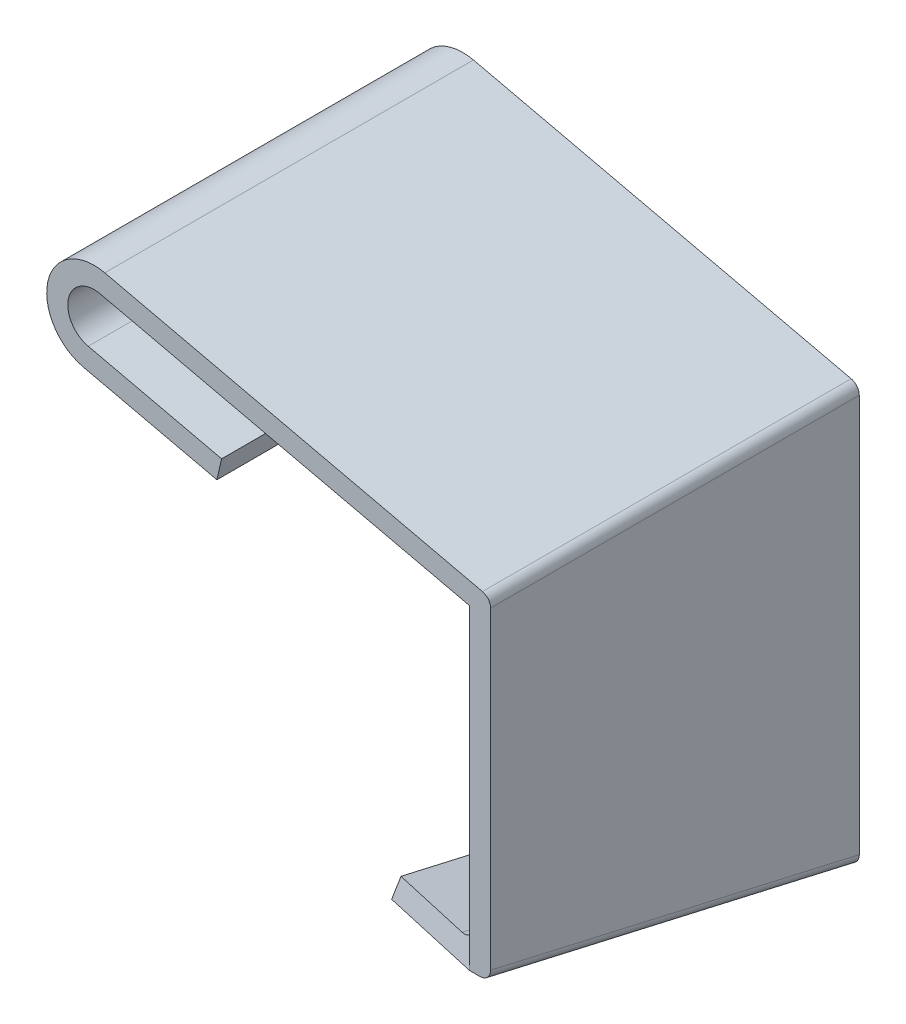
ISO-10303-21;
HEADER;
FILE_DESCRIPTION(('STEP AP214'),'2;1');
FILE_NAME('part.step','',(''),(''),'','','');
FILE_SCHEMA(('AUTOMOTIVE_DESIGN { 1 0 10303 214 1 1 1 1 }'));
ENDSEC;
DATA;
#1=APPLICATION_CONTEXT('core data for automotive mechanical design processes');
#2=APPLICATION_PROTOCOL_DEFINITION('international standard','automotive_design',2000,#1);
#3=PRODUCT_CONTEXT('',#1,'mechanical');
#4=PRODUCT('Part','Part','',(#3));
#5=PRODUCT_RELATED_PRODUCT_CATEGORY('part','',(#4));
#6=PRODUCT_DEFINITION_FORMATION('','',#4);
#7=PRODUCT_DEFINITION_CONTEXT('part definition',#1,'design');
#8=PRODUCT_DEFINITION('design','',#6,#7);
#9=PRODUCT_DEFINITION_SHAPE('','',#8);
#10=(LENGTH_UNIT() NAMED_UNIT(*) SI_UNIT(.MILLI.,.METRE.));
#11=(NAMED_UNIT(*) PLANE_ANGLE_UNIT() SI_UNIT($,.RADIAN.));
#12=(NAMED_UNIT(*) SI_UNIT($,.STERADIAN.) SOLID_ANGLE_UNIT());
#13=UNCERTAINTY_MEASURE_WITH_UNIT(LENGTH_MEASURE(1.E-05),#10,'distance_accuracy_value','');
#14=(GEOMETRIC_REPRESENTATION_CONTEXT(3) GLOBAL_UNCERTAINTY_ASSIGNED_CONTEXT((#13)) GLOBAL_UNIT_ASSIGNED_CONTEXT((#10,
#11,#12)) REPRESENTATION_CONTEXT('',''));
#15=CARTESIAN_POINT('',(0.,0.,0.));
#16=DIRECTION('',(0.,0.,1.));
#17=DIRECTION('',(1.,0.,0.));
#18=AXIS2_PLACEMENT_3D('',#15,#16,#17);
#19=CARTESIAN_POINT('',(-36.6519797126755,22.2084590531682,35.));
#20=DIRECTION('',(0.224951054343865,0.974370064785235,0.));
#21=DIRECTION('',(-0.974370064785235,0.224951054343865,0.));
#22=AXIS2_PLACEMENT_3D('',#19,#20,#21);
#23=PLANE('',#22);
#24=DIRECTION('',(0.974370064785235,-0.224951054343865,0.));
#25=VECTOR('',#24,1.);
#26=CARTESIAN_POINT('',(-36.6519797126755,22.2084590531682,0.));
#27=LINE('',#26,#25);
#28=CARTESIAN_POINT('',(-36.6519797126755,22.2084590531682,0.));
#29=VERTEX_POINT('',#28);
#30=CARTESIAN_POINT('',(-23.9851688704675,19.284095346698,0.));
#31=VERTEX_POINT('',#30);
#32=EDGE_CURVE('E226',#29,#31,#27,.T.);
#33=ORIENTED_EDGE('',*,*,#32,.T.);
#34=DIRECTION('',(0.,0.,-1.));
#35=VECTOR('',#34,1.);
#36=CARTESIAN_POINT('',(-23.9851688704675,19.284095346698,35.));
#37=LINE('',#36,#35);
#38=CARTESIAN_POINT('',(-23.9851688704675,19.284095346698,35.));
#39=VERTEX_POINT('',#38);
#40=EDGE_CURVE('E314',#39,#31,#37,.T.);
#41=ORIENTED_EDGE('',*,*,#40,.F.);
#42=DIRECTION('',(0.974370064785235,-0.224951054343865,0.));
#43=VECTOR('',#42,1.);
#44=CARTESIAN_POINT('',(-36.6519797126755,22.2084590531682,35.));
#45=LINE('',#44,#43);
#46=CARTESIAN_POINT('',(-36.6519797126755,22.2084590531682,35.));
#47=VERTEX_POINT('',#46);
#48=EDGE_CURVE('E227',#47,#39,#45,.T.);
#49=ORIENTED_EDGE('',*,*,#48,.F.);
#50=DIRECTION('',(0.,0.,-1.));
#51=VECTOR('',#50,1.);
#52=CARTESIAN_POINT('',(-36.6519797126755,22.2084590531682,35.));
#53=LINE('',#52,#51);
#54=EDGE_CURVE('E263',#47,#29,#53,.T.);
#55=ORIENTED_EDGE('',*,*,#54,.T.);
#56=EDGE_LOOP('',(#33,#41,#49,#55));
#57=FACE_BOUND('',#56,.T.);
#58=ADVANCED_FACE('F39',(#57),#23,.F.);
#59=CARTESIAN_POINT('',(-23.5352667617797,21.2328354762685,35.));
#60=DIRECTION('',(0.974370064785236,-0.224951054343862,0.));
#61=DIRECTION('',(0.224951054343862,0.974370064785236,0.));
#62=AXIS2_PLACEMENT_3D('',#59,#60,#61);
#63=PLANE('',#62);
#64=DIRECTION('',(-0.224951054343862,-0.974370064785236,0.));
#65=VECTOR('',#64,1.);
#66=CARTESIAN_POINT('',(-23.5352667617797,21.2328354762685,0.));
#67=LINE('',#66,#65);
#68=CARTESIAN_POINT('',(-23.5352667617797,21.2328354762685,0.));
#69=VERTEX_POINT('',#68);
#70=EDGE_CURVE('E267',#69,#31,#67,.T.);
#71=ORIENTED_EDGE('',*,*,#70,.F.);
#72=DIRECTION('',(0.,0.,-1.));
#73=VECTOR('',#72,1.);
#74=CARTESIAN_POINT('',(-23.5352667617797,21.2328354762685,35.));
#75=LINE('',#74,#73);
#76=CARTESIAN_POINT('',(-23.5352667617797,21.2328354762685,35.));
#77=VERTEX_POINT('',#76);
#78=EDGE_CURVE('E311',#77,#69,#75,.T.);
#79=ORIENTED_EDGE('',*,*,#78,.F.);
#80=DIRECTION('',(-0.224951054343862,-0.974370064785236,0.));
#81=VECTOR('',#80,1.);
#82=CARTESIAN_POINT('',(-23.5352667617797,21.2328354762685,35.));
#83=LINE('',#82,#81);
#84=EDGE_CURVE('E230',#77,#39,#83,.T.);
#85=ORIENTED_EDGE('',*,*,#84,.T.);
#86=ORIENTED_EDGE('',*,*,#40,.T.);
#87=EDGE_LOOP('',(#71,#79,#85,#86));
#88=FACE_BOUND('',#87,.T.);
#89=ADVANCED_FACE('F385',(#88),#63,.T.);
#90=CARTESIAN_POINT('',(-36.2020776039878,24.1571991827387,35.));
#91=DIRECTION('',(0.224951054343865,0.974370064785235,0.));
#92=DIRECTION('',(-0.974370064785235,0.224951054343865,0.));
#93=AXIS2_PLACEMENT_3D('',#90,#91,#92);
#94=PLANE('',#93);
#95=DIRECTION('',(0.974370064785235,-0.224951054343865,0.));
#96=VECTOR('',#95,1.);
#97=CARTESIAN_POINT('',(-36.2020776039878,24.1571991827387,0.));
#98=LINE('',#97,#96);
#99=CARTESIAN_POINT('',(-36.2020776039878,24.1571991827387,0.));
#100=VERTEX_POINT('',#99);
#101=EDGE_CURVE('E271',#100,#69,#98,.T.);
#102=ORIENTED_EDGE('',*,*,#101,.F.);
#103=DIRECTION('',(0.,0.,-1.));
#104=VECTOR('',#103,1.);
#105=CARTESIAN_POINT('',(-36.2020776039878,24.1571991827387,35.));
#106=LINE('',#105,#104);
#107=CARTESIAN_POINT('',(-36.2020776039878,24.1571991827387,35.));
#108=VERTEX_POINT('',#107);
#109=EDGE_CURVE('E308',#108,#100,#106,.T.);
#110=ORIENTED_EDGE('',*,*,#109,.F.);
#111=DIRECTION('',(0.974370064785235,-0.224951054343865,0.));
#112=VECTOR('',#111,1.);
#113=CARTESIAN_POINT('',(-36.2020776039878,24.1571991827387,35.));
#114=LINE('',#113,#112);
#115=EDGE_CURVE('E235',#108,#77,#114,.T.);
#116=ORIENTED_EDGE('',*,*,#115,.T.);
#117=ORIENTED_EDGE('',*,*,#78,.T.);
#118=EDGE_LOOP('',(#102,#110,#116,#117));
#119=FACE_BOUND('',#118,.T.);
#120=ADVANCED_FACE('F391',(#119),#94,.T.);
#121=CARTESIAN_POINT('',(-35.6396999681281,26.5931243447018,35.));
#122=DIRECTION('',(0.,0.,-1.));
#123=DIRECTION('',(-1.,0.,0.));
#124=AXIS2_PLACEMENT_3D('',#121,#122,#123);
#125=CYLINDRICAL_SURFACE('',#124,2.5);
#126=CARTESIAN_POINT('',(-35.6396999681281,26.5931243447018,0.));
#127=DIRECTION('',(0.,0.,1.));
#128=DIRECTION('',(1.,0.,0.));
#129=AXIS2_PLACEMENT_3D('',#126,#127,#128);
#130=CIRCLE('',#129,2.5);
#131=CARTESIAN_POINT('',(-35.0773223322685,29.0290495066649,0.));
#132=VERTEX_POINT('',#131);
#133=EDGE_CURVE('E275',#132,#100,#130,.T.);
#134=ORIENTED_EDGE('',*,*,#133,.F.);
#135=DIRECTION('',(0.,0.,-1.));
#136=VECTOR('',#135,1.);
#137=CARTESIAN_POINT('',(-35.0773223322685,29.0290495066649,35.));
#138=LINE('',#137,#136);
#139=CARTESIAN_POINT('',(-35.0773223322685,29.0290495066649,35.));
#140=VERTEX_POINT('',#139);
#141=EDGE_CURVE('E305',#140,#132,#138,.T.);
#142=ORIENTED_EDGE('',*,*,#141,.F.);
#143=CARTESIAN_POINT('',(-35.6396999681281,26.5931243447018,35.));
#144=DIRECTION('',(0.,0.,1.));
#145=DIRECTION('',(1.,0.,0.));
#146=AXIS2_PLACEMENT_3D('',#143,#144,#145);
#147=CIRCLE('',#146,2.5);
#148=EDGE_CURVE('E239',#140,#108,#147,.T.);
#149=ORIENTED_EDGE('',*,*,#148,.T.);
#150=ORIENTED_EDGE('',*,*,#109,.T.);
#151=EDGE_LOOP('',(#134,#142,#149,#150));
#152=FACE_BOUND('',#151,.T.);
#153=ADVANCED_FACE('F428',(#152),#125,.F.);
#154=CARTESIAN_POINT('',(0.,20.9308115502857,35.));
#155=DIRECTION('',(-0.224951054343865,-0.974370064785235,0.));
#156=DIRECTION('',(0.974370064785235,-0.224951054343865,0.));
#157=AXIS2_PLACEMENT_3D('',#154,#155,#156);
#158=PLANE('',#157);
#159=DIRECTION('',(-0.974370064785235,0.224951054343865,0.));
#160=VECTOR('',#159,1.);
#161=CARTESIAN_POINT('',(0.,20.9308115502857,0.));
#162=LINE('',#161,#160);
#163=CARTESIAN_POINT('',(0.,20.9308115502857,0.));
#164=VERTEX_POINT('',#163);
#165=EDGE_CURVE('E279',#164,#132,#162,.T.);
#166=ORIENTED_EDGE('',*,*,#165,.F.);
#167=DIRECTION('',(0.,0.,-1.));
#168=VECTOR('',#167,1.);
#169=CARTESIAN_POINT('',(0.,20.9308115502857,35.));
#170=LINE('',#169,#168);
#171=CARTESIAN_POINT('',(0.,20.9308115502857,35.));
#172=VERTEX_POINT('',#171);
#173=EDGE_CURVE('E301',#172,#164,#170,.T.);
#174=ORIENTED_EDGE('',*,*,#173,.F.);
#175=DIRECTION('',(-0.974370064785235,0.224951054343865,0.));
#176=VECTOR('',#175,1.);
#177=CARTESIAN_POINT('',(0.,20.9308115502857,35.));
#178=LINE('',#177,#176);
#179=EDGE_CURVE('E243',#172,#140,#178,.T.);
#180=ORIENTED_EDGE('',*,*,#179,.T.);
#181=ORIENTED_EDGE('',*,*,#141,.T.);
#182=EDGE_LOOP('',(#166,#174,#180,#181));
#183=FACE_BOUND('',#182,.T.);
#184=ADVANCED_FACE('F430',(#183),#158,.T.);
#185=CARTESIAN_POINT('',(0.,-9.06918844971427,35.));
#186=DIRECTION('',(-1.,0.,0.));
#187=DIRECTION('',(0.,0.,1.));
#188=AXIS2_PLACEMENT_3D('',#185,#186,#187);
#189=PLANE('',#188);
#190=DIRECTION('',(0.,1.,0.));
#191=VECTOR('',#190,1.);
#192=CARTESIAN_POINT('',(0.,-9.06918844971427,0.));
#193=LINE('',#192,#191);
#194=CARTESIAN_POINT('',(0.,-13.6740490605687,0.));
#195=VERTEX_POINT('',#194);
#196=EDGE_CURVE('E283',#195,#164,#193,.T.);
#197=ORIENTED_EDGE('',*,*,#196,.F.);
#198=DIRECTION('',(0.,-0.222824801502141,-0.974858506571867));
#199=VECTOR('',#198,1.);
#200=CARTESIAN_POINT('',(0.,-5.84262076026254,34.2624988138396));
#201=LINE('',#200,#199);
#202=CARTESIAN_POINT('',(0.,-5.84262076026254,34.2624988138396));
#203=VERTEX_POINT('',#202);
#204=EDGE_CURVE('E323',#195,#203,#201,.F.);
#205=ORIENTED_EDGE('',*,*,#204,.T.);
#206=DIRECTION('',(0.,-0.974858506571867,0.222824801502141));
#207=VECTOR('',#206,1.);
#208=CARTESIAN_POINT('',(0.,-9.06918844971427,35.));
#209=LINE('',#208,#207);
#210=CARTESIAN_POINT('',(0.,-9.06918844971428,35.));
#211=VERTEX_POINT('',#210);
#212=EDGE_CURVE('E215',#203,#211,#209,.T.);
#213=ORIENTED_EDGE('',*,*,#212,.T.);
#214=DIRECTION('',(0.,1.,0.));
#215=VECTOR('',#214,1.);
#216=CARTESIAN_POINT('',(0.,-9.06918844971427,35.));
#217=LINE('',#216,#215);
#218=EDGE_CURVE('E247',#211,#172,#217,.T.);
#219=ORIENTED_EDGE('',*,*,#218,.T.);
#220=ORIENTED_EDGE('',*,*,#173,.T.);
#221=EDGE_LOOP('',(#197,#205,#213,#219,#220));
#222=FACE_BOUND('',#221,.T.);
#223=ADVANCED_FACE('F359',(#222),#189,.T.);
#224=CARTESIAN_POINT('',(2.,-9.06918844971427,35.));
#225=DIRECTION('',(-1.,0.,0.));
#226=DIRECTION('',(0.,0.,1.));
#227=AXIS2_PLACEMENT_3D('',#224,#225,#226);
#228=PLANE('',#227);
#229=DIRECTION('',(0.,1.,0.));
#230=VECTOR('',#229,1.);
#231=CARTESIAN_POINT('',(2.,-9.06918844971427,0.));
#232=LINE('',#231,#230);
#233=CARTESIAN_POINT('',(2.,-16.0433985599419,0.));
#234=VERTEX_POINT('',#233);
#235=CARTESIAN_POINT('',(2.,21.7262474669536,0.));
#236=VERTEX_POINT('',#235);
#237=EDGE_CURVE('E286',#234,#236,#232,.T.);
#238=ORIENTED_EDGE('',*,*,#237,.T.);
#239=DIRECTION('',(0.,0.,-1.));
#240=VECTOR('',#239,1.);
#241=CARTESIAN_POINT('',(2.,21.7262474669536,35.));
#242=LINE('',#241,#240);
#243=CARTESIAN_POINT('',(2.,21.7262474669536,35.));
#244=VERTEX_POINT('',#243);
#245=EDGE_CURVE('E63',#236,#244,#242,.F.);
#246=ORIENTED_EDGE('',*,*,#245,.T.);
#247=DIRECTION('',(0.,1.,0.));
#248=VECTOR('',#247,1.);
#249=CARTESIAN_POINT('',(2.,-9.06918844971427,35.));
#250=LINE('',#249,#248);
#251=CARTESIAN_POINT('',(2.,-8.04339855994191,35.));
#252=VERTEX_POINT('',#251);
#253=EDGE_CURVE('E254',#252,#244,#250,.T.);
#254=ORIENTED_EDGE('',*,*,#253,.F.);
#255=DIRECTION('',(0.,0.222824801502141,0.974858506571867));
#256=VECTOR('',#255,1.);
#257=CARTESIAN_POINT('',(2.,-8.0943299431424,34.7771751984979));
#258=LINE('',#257,#256);
#259=EDGE_CURVE('E337',#252,#234,#258,.F.);
#260=ORIENTED_EDGE('',*,*,#259,.T.);
#261=EDGE_LOOP('',(#238,#246,#254,#260));
#262=FACE_BOUND('',#261,.T.);
#263=ADVANCED_FACE('F434',(#262),#228,.F.);
#264=CARTESIAN_POINT('',(0.449902108687731,22.8795516798562,35.));
#265=DIRECTION('',(-0.224951054343865,-0.974370064785235,0.));
#266=DIRECTION('',(0.974370064785235,-0.224951054343865,0.));
#267=AXIS2_PLACEMENT_3D('',#264,#265,#266);
#268=PLANE('',#267);
#269=DIRECTION('',(-0.974370064785235,0.224951054343865,0.));
#270=VECTOR('',#269,1.);
#271=CARTESIAN_POINT('',(0.449902108687731,22.8795516798562,35.));
#272=LINE('',#271,#270);
#273=CARTESIAN_POINT('',(1.22495105434386,22.7006175317388,35.));
#274=VERTEX_POINT('',#273);
#275=CARTESIAN_POINT('',(-34.6274202235807,30.9777896362354,35.));
#276=VERTEX_POINT('',#275);
#277=EDGE_CURVE('E257',#274,#276,#272,.T.);
#278=ORIENTED_EDGE('',*,*,#277,.F.);
#279=DIRECTION('',(0.,0.,-1.));
#280=VECTOR('',#279,1.);
#281=CARTESIAN_POINT('',(1.22495105434386,22.7006175317388,35.));
#282=LINE('',#281,#280);
#283=CARTESIAN_POINT('',(1.22495105434386,22.7006175317388,0.));
#284=VERTEX_POINT('',#283);
#285=EDGE_CURVE('E327',#274,#284,#282,.T.);
#286=ORIENTED_EDGE('',*,*,#285,.T.);
#287=DIRECTION('',(-0.974370064785235,0.224951054343865,0.));
#288=VECTOR('',#287,1.);
#289=CARTESIAN_POINT('',(0.449902108687731,22.8795516798562,0.));
#290=LINE('',#289,#288);
#291=CARTESIAN_POINT('',(-34.6274202235807,30.9777896362354,0.));
#292=VERTEX_POINT('',#291);
#293=EDGE_CURVE('E289',#284,#292,#290,.T.);
#294=ORIENTED_EDGE('',*,*,#293,.T.);
#295=DIRECTION('',(0.,0.,-1.));
#296=VECTOR('',#295,1.);
#297=CARTESIAN_POINT('',(-34.6274202235807,30.9777896362354,35.));
#298=LINE('',#297,#296);
#299=EDGE_CURVE('E297',#276,#292,#298,.T.);
#300=ORIENTED_EDGE('',*,*,#299,.F.);
#301=EDGE_LOOP('',(#278,#286,#294,#300));
#302=FACE_BOUND('',#301,.T.);
#303=ADVANCED_FACE('F410',(#302),#268,.F.);
#304=CARTESIAN_POINT('',(-35.6396999681281,26.5931243447018,35.));
#305=DIRECTION('',(0.,0.,-1.));
#306=DIRECTION('',(-1.,0.,0.));
#307=AXIS2_PLACEMENT_3D('',#304,#305,#306);
#308=CYLINDRICAL_SURFACE('',#307,4.5);
#309=CARTESIAN_POINT('',(-35.6396999681281,26.5931243447018,0.));
#310=DIRECTION('',(0.,0.,1.));
#311=DIRECTION('',(1.,0.,0.));
#312=AXIS2_PLACEMENT_3D('',#309,#310,#311);
#313=CIRCLE('',#312,4.5);
#314=EDGE_CURVE('E231',#292,#29,#313,.T.);
#315=ORIENTED_EDGE('',*,*,#314,.T.);
#316=ORIENTED_EDGE('',*,*,#54,.F.);
#317=CARTESIAN_POINT('',(-35.6396999681281,26.5931243447018,35.));
#318=DIRECTION('',(0.,0.,1.));
#319=DIRECTION('',(1.,0.,0.));
#320=AXIS2_PLACEMENT_3D('',#317,#318,#319);
#321=CIRCLE('',#320,4.5);
#322=EDGE_CURVE('E260',#276,#47,#321,.T.);
#323=ORIENTED_EDGE('',*,*,#322,.F.);
#324=ORIENTED_EDGE('',*,*,#299,.T.);
#325=EDGE_LOOP('',(#315,#316,#323,#324));
#326=FACE_BOUND('',#325,.T.);
#327=ADVANCED_FACE('F415',(#326),#308,.T.);
#328=CARTESIAN_POINT('',(-35.6396999681281,26.5931243447018,35.));
#329=DIRECTION('',(0.,0.,1.));
#330=DIRECTION('',(1.,0.,0.));
#331=AXIS2_PLACEMENT_3D('',#328,#329,#330);
#332=PLANE('',#331);
#333=ORIENTED_EDGE('',*,*,#253,.T.);
#334=CARTESIAN_POINT('',(1.,21.7262474669536,35.));
#335=DIRECTION('',(0.,0.,1.));
#336=DIRECTION('',(1.,0.,0.));
#337=AXIS2_PLACEMENT_3D('',#334,#335,#336);
#338=CIRCLE('',#337,1.);
#339=EDGE_CURVE('E344',#244,#274,#338,.T.);
#340=ORIENTED_EDGE('',*,*,#339,.T.);
#341=ORIENTED_EDGE('',*,*,#277,.T.);
#342=ORIENTED_EDGE('',*,*,#322,.T.);
#343=ORIENTED_EDGE('',*,*,#48,.T.);
#344=ORIENTED_EDGE('',*,*,#84,.F.);
#345=ORIENTED_EDGE('',*,*,#115,.F.);
#346=ORIENTED_EDGE('',*,*,#148,.F.);
#347=ORIENTED_EDGE('',*,*,#179,.F.);
#348=ORIENTED_EDGE('',*,*,#218,.F.);
#349=DIRECTION('',(-1.,0.,0.));
#350=VECTOR('',#349,1.);
#351=CARTESIAN_POINT('',(2.,-9.06918844971427,35.));
#352=LINE('',#351,#350);
#353=CARTESIAN_POINT('',(1.,-9.06918844971427,35.));
#354=VERTEX_POINT('',#353);
#355=EDGE_CURVE('E251',#354,#211,#352,.T.);
#356=ORIENTED_EDGE('',*,*,#355,.F.);
#357=CARTESIAN_POINT('',(1.,-8.04339855994191,35.));
#358=DIRECTION('',(0.,0.,1.));
#359=DIRECTION('',(0.,1.,0.));
#360=AXIS2_PLACEMENT_3D('',#357,#358,#359);
#361=ELLIPSE('',#360,1.02578988977236,1.);
#362=EDGE_CURVE('E55',#354,#252,#361,.T.);
#363=ORIENTED_EDGE('',*,*,#362,.T.);
#364=EDGE_LOOP('',(#333,#340,#341,#342,#343,#344,#345,#346,#347,#348,#356,#363));
#365=FACE_BOUND('',#364,.T.);
#366=ADVANCED_FACE('F407',(#365),#332,.T.);
#367=CARTESIAN_POINT('',(-35.6396999681281,26.5931243447018,0.));
#368=DIRECTION('',(0.,0.,1.));
#369=DIRECTION('',(1.,0.,0.));
#370=AXIS2_PLACEMENT_3D('',#367,#368,#369);
#371=PLANE('',#370);
#372=ORIENTED_EDGE('',*,*,#293,.F.);
#373=CARTESIAN_POINT('',(1.,21.7262474669536,0.));
#374=DIRECTION('',(0.,0.,1.));
#375=DIRECTION('',(1.,0.,0.));
#376=AXIS2_PLACEMENT_3D('',#373,#374,#375);
#377=CIRCLE('',#376,1.);
#378=EDGE_CURVE('E334',#284,#236,#377,.F.);
#379=ORIENTED_EDGE('',*,*,#378,.T.);
#380=ORIENTED_EDGE('',*,*,#237,.F.);
#381=CARTESIAN_POINT('',(1.,-16.0433985599419,0.));
#382=DIRECTION('',(0.,0.,1.));
#383=DIRECTION('',(0.,1.,0.));
#384=AXIS2_PLACEMENT_3D('',#381,#382,#383);
#385=ELLIPSE('',#384,1.02578988977236,1.);
#386=CARTESIAN_POINT('',(1.,-17.0691884497143,0.));
#387=VERTEX_POINT('',#386);
#388=EDGE_CURVE('E331',#234,#387,#385,.F.);
#389=ORIENTED_EDGE('',*,*,#388,.T.);
#390=DIRECTION('',(-1.,0.,0.));
#391=VECTOR('',#390,1.);
#392=CARTESIAN_POINT('',(37.9026461420325,-17.0691884497143,0.));
#393=LINE('',#392,#391);
#394=CARTESIAN_POINT('',(0.,-17.0691884497143,0.));
#395=VERTEX_POINT('',#394);
#396=EDGE_CURVE('E223',#387,#395,#393,.T.);
#397=ORIENTED_EDGE('',*,*,#396,.T.);
#398=DIRECTION('',(-0.219571457135792,-0.975596420253409,0.));
#399=VECTOR('',#398,1.);
#400=CARTESIAN_POINT('',(7.63479273825065,16.8536017069663,0.));
#401=LINE('',#400,#399);
#402=CARTESIAN_POINT('',(0.449902108687732,-15.0701905270072,0.));
#403=VERTEX_POINT('',#402);
#404=EDGE_CURVE('E205',#403,#395,#401,.T.);
#405=ORIENTED_EDGE('',*,*,#404,.F.);
#406=DIRECTION('',(-0.973084618875934,0.230448095038943,0.));
#407=VECTOR('',#406,1.);
#408=CARTESIAN_POINT('',(-43.0659245877992,-4.76467426282636,0.));
#409=LINE('',#408,#407);
#410=CARTESIAN_POINT('',(-1.22495105434386,-14.6735480219223,0.));
#411=VERTEX_POINT('',#410);
#412=EDGE_CURVE('E317',#403,#411,#409,.T.);
#413=ORIENTED_EDGE('',*,*,#412,.T.);
#414=CARTESIAN_POINT('',(-1.,-13.6740490605687,0.));
#415=DIRECTION('',(0.,0.,1.));
#416=DIRECTION('',(0.,1.,0.));
#417=AXIS2_PLACEMENT_3D('',#414,#415,#416);
#418=ELLIPSE('',#417,1.02578988977236,1.);
#419=EDGE_CURVE('E48',#411,#195,#418,.T.);
#420=ORIENTED_EDGE('',*,*,#419,.T.);
#421=ORIENTED_EDGE('',*,*,#196,.T.);
#422=ORIENTED_EDGE('',*,*,#165,.T.);
#423=ORIENTED_EDGE('',*,*,#133,.T.);
#424=ORIENTED_EDGE('',*,*,#101,.T.);
#425=ORIENTED_EDGE('',*,*,#70,.T.);
#426=ORIENTED_EDGE('',*,*,#32,.F.);
#427=ORIENTED_EDGE('',*,*,#314,.F.);
#428=EDGE_LOOP('',(#372,#379,#380,#389,#397,#405,#413,#420,#421,#422,#423,#424,#425,#426,#427));
#429=FACE_BOUND('',#428,.T.);
#430=ADVANCED_FACE('F354',(#429),#371,.F.);
#431=CARTESIAN_POINT('',(37.9026461420325,-9.06918844971427,35.));
#432=DIRECTION('',(0.,0.974858506571867,-0.222824801502141));
#433=DIRECTION('',(0.,0.222824801502141,0.974858506571867));
#434=AXIS2_PLACEMENT_3D('',#431,#432,#433);
#435=PLANE('',#434);
#436=ORIENTED_EDGE('',*,*,#396,.F.);
#437=DIRECTION('',(0.,0.222824801502141,0.974858506571867));
#438=VECTOR('',#437,1.);
#439=CARTESIAN_POINT('',(1.,-9.06918844971427,35.));
#440=LINE('',#439,#438);
#441=EDGE_CURVE('E347',#387,#354,#440,.T.);
#442=ORIENTED_EDGE('',*,*,#441,.T.);
#443=ORIENTED_EDGE('',*,*,#355,.T.);
#444=DIRECTION('',(0.,-0.222824801502141,-0.974858506571867));
#445=VECTOR('',#444,1.);
#446=CARTESIAN_POINT('',(0.,-9.06918844971427,35.));
#447=LINE('',#446,#445);
#448=EDGE_CURVE('E219',#211,#395,#447,.T.);
#449=ORIENTED_EDGE('',*,*,#448,.T.);
#450=EDGE_LOOP('',(#436,#442,#443,#449));
#451=FACE_BOUND('',#450,.T.);
#452=ADVANCED_FACE('F433',(#451),#435,.F.);
#453=CARTESIAN_POINT('',(3.64725748911441,-0.820865703080651,0.187626446418434));
#454=DIRECTION('',(-0.974370064785235,0.219295448889428,-0.0501246740318692));
#455=DIRECTION('',(0.,-0.222824801502141,-0.974858506571867));
#456=AXIS2_PLACEMENT_3D('',#453,#454,#455);
#457=PLANE('',#456);
#458=DIRECTION('',(0.,0.222824801502141,0.974858506571867));
#459=VECTOR('',#458,1.);
#460=CARTESIAN_POINT('',(0.449902108687732,-15.1694425573045,-0.434227632550794));
#461=LINE('',#460,#459);
#462=CARTESIAN_POINT('',(0.449902108687732,-15.1694425573045,-0.434227632550794));
#463=VERTEX_POINT('',#462);
#464=EDGE_CURVE('E193',#463,#403,#461,.T.);
#465=ORIENTED_EDGE('',*,*,#464,.T.);
#466=ORIENTED_EDGE('',*,*,#404,.T.);
#467=DIRECTION('',(-0.224951054343866,-0.949872946204868,0.217113816275398));
#468=VECTOR('',#467,1.);
#469=CARTESIAN_POINT('',(0.449902108687732,-15.1694425573045,-0.434227632550794));
#470=LINE('',#469,#468);
#471=EDGE_CURVE('E189',#463,#395,#470,.T.);
#472=ORIENTED_EDGE('',*,*,#471,.F.);
#473=EDGE_LOOP('',(#465,#466,#472));
#474=FACE_BOUND('',#473,.T.);
#475=ADVANCED_FACE('F364',(#474),#457,.F.);
#476=CARTESIAN_POINT('',(-7.34505840959415,-13.4150789661891,-0.835225024805748));
#477=DIRECTION('',(0.224951054343866,0.949872946204868,-0.217113816275398));
#478=DIRECTION('',(-0.973084618875934,0.230448095038943,0.));
#479=AXIS2_PLACEMENT_3D('',#476,#477,#478);
#480=PLANE('',#479);
#481=DIRECTION('',(0.974370064785235,-0.219295448889428,0.0501246740318692));
#482=VECTOR('',#481,1.);
#483=CARTESIAN_POINT('',(-7.34505840959415,-5.41507896618912,34.1647749751942));
#484=LINE('',#483,#482);
#485=CARTESIAN_POINT('',(-7.34505840959415,-5.41507896618912,34.1647749751942));
#486=VERTEX_POINT('',#485);
#487=CARTESIAN_POINT('',(-1.22495105434386,-6.79249370646741,34.479612630115));
#488=VERTEX_POINT('',#487);
#489=EDGE_CURVE('E174',#486,#488,#484,.T.);
#490=ORIENTED_EDGE('',*,*,#489,.T.);
#491=DIRECTION('',(0.,-0.222824801502141,-0.974858506571867));
#492=VECTOR('',#491,1.);
#493=CARTESIAN_POINT('',(-1.22495105434387,-14.6879515308789,-0.0630153516852106));
#494=LINE('',#493,#492);
#495=EDGE_CURVE('E320',#488,#411,#494,.T.);
#496=ORIENTED_EDGE('',*,*,#495,.T.);
#497=ORIENTED_EDGE('',*,*,#412,.F.);
#498=ORIENTED_EDGE('',*,*,#464,.F.);
#499=DIRECTION('',(0.974370064785235,-0.219295448889428,0.0501246740318692));
#500=VECTOR('',#499,1.);
#501=CARTESIAN_POINT('',(-7.34505840959415,-13.4150789661891,-0.835225024805748));
#502=LINE('',#501,#500);
#503=CARTESIAN_POINT('',(-7.34505840959415,-13.4150789661891,-0.835225024805748));
#504=VERTEX_POINT('',#503);
#505=EDGE_CURVE('E186',#504,#463,#502,.T.);
#506=ORIENTED_EDGE('',*,*,#505,.F.);
#507=DIRECTION('',(0.,0.222824801502141,0.974858506571867));
#508=VECTOR('',#507,1.);
#509=CARTESIAN_POINT('',(-7.34505840959415,-13.4150789661891,-0.835225024805748));
#510=LINE('',#509,#508);
#511=EDGE_CURVE('E165',#504,#486,#510,.T.);
#512=ORIENTED_EDGE('',*,*,#511,.T.);
#513=EDGE_LOOP('',(#490,#496,#497,#498,#506,#512));
#514=FACE_BOUND('',#513,.T.);
#515=ADVANCED_FACE('F184',(#514),#480,.T.);
#516=CARTESIAN_POINT('',(-7.34505840959415,-13.4150789661891,-0.835225024805748));
#517=DIRECTION('',(0.,0.222824801502141,0.974858506571867));
#518=DIRECTION('',(0.,-0.974858506571867,0.222824801502141));
#519=AXIS2_PLACEMENT_3D('',#516,#517,#518);
#520=PLANE('',#519);
#521=ORIENTED_EDGE('',*,*,#471,.T.);
#522=DIRECTION('',(0.974370064785235,-0.219295448889428,0.0501246740318692));
#523=VECTOR('',#522,1.);
#524=CARTESIAN_POINT('',(-7.79496051828188,-15.3148248585989,-0.400997392254951));
#525=LINE('',#524,#523);
#526=CARTESIAN_POINT('',(-7.79496051828188,-15.3148248585989,-0.400997392254951));
#527=VERTEX_POINT('',#526);
#528=EDGE_CURVE('E206',#527,#395,#525,.T.);
#529=ORIENTED_EDGE('',*,*,#528,.F.);
#530=DIRECTION('',(-0.224951054343866,-0.949872946204868,0.217113816275398));
#531=VECTOR('',#530,1.);
#532=CARTESIAN_POINT('',(-7.34505840959415,-13.4150789661891,-0.835225024805748));
#533=LINE('',#532,#531);
#534=EDGE_CURVE('E182',#504,#527,#533,.T.);
#535=ORIENTED_EDGE('',*,*,#534,.F.);
#536=ORIENTED_EDGE('',*,*,#505,.T.);
#537=EDGE_LOOP('',(#521,#529,#535,#536));
#538=FACE_BOUND('',#537,.T.);
#539=ADVANCED_FACE('F374',(#538),#520,.F.);
#540=CARTESIAN_POINT('',(-7.79496051828188,-15.3148248585989,-0.400997392254951));
#541=DIRECTION('',(0.224951054343866,0.949872946204868,-0.217113816275398));
#542=DIRECTION('',(-0.973084618875934,0.230448095038943,0.));
#543=AXIS2_PLACEMENT_3D('',#540,#541,#542);
#544=PLANE('',#543);
#545=ORIENTED_EDGE('',*,*,#448,.F.);
#546=DIRECTION('',(0.974370064785235,-0.219295448889428,0.0501246740318692));
#547=VECTOR('',#546,1.);
#548=CARTESIAN_POINT('',(-7.79496051828188,-7.31482485859886,34.599002607745));
#549=LINE('',#548,#547);
#550=CARTESIAN_POINT('',(-7.79496051828188,-7.31482485859886,34.599002607745));
#551=VERTEX_POINT('',#550);
#552=EDGE_CURVE('E181',#551,#211,#549,.T.);
#553=ORIENTED_EDGE('',*,*,#552,.F.);
#554=DIRECTION('',(0.,0.222824801502141,0.974858506571867));
#555=VECTOR('',#554,1.);
#556=CARTESIAN_POINT('',(-7.79496051828188,-15.3148248585989,-0.400997392254951));
#557=LINE('',#556,#555);
#558=EDGE_CURVE('E167',#527,#551,#557,.T.);
#559=ORIENTED_EDGE('',*,*,#558,.F.);
#560=ORIENTED_EDGE('',*,*,#528,.T.);
#561=EDGE_LOOP('',(#545,#553,#559,#560));
#562=FACE_BOUND('',#561,.T.);
#563=ADVANCED_FACE('F372',(#562),#544,.F.);
#564=CARTESIAN_POINT('',(-7.79496051828188,-7.31482485859886,34.599002607745));
#565=DIRECTION('',(0.,-0.222824801502141,-0.974858506571867));
#566=DIRECTION('',(0.,0.974858506571867,-0.222824801502141));
#567=AXIS2_PLACEMENT_3D('',#564,#565,#566);
#568=PLANE('',#567);
#569=ORIENTED_EDGE('',*,*,#212,.F.);
#570=CARTESIAN_POINT('',(-1.,-5.84262076026254,34.2624988138396));
#571=DIRECTION('',(0.,-0.222824801502141,-0.974858506571867));
#572=DIRECTION('',(0.,0.974858506571867,-0.222824801502141));
#573=AXIS2_PLACEMENT_3D('',#570,#571,#572);
#574=CIRCLE('',#573,1.);
#575=EDGE_CURVE('E11',#203,#488,#574,.T.);
#576=ORIENTED_EDGE('',*,*,#575,.T.);
#577=ORIENTED_EDGE('',*,*,#489,.F.);
#578=DIRECTION('',(0.224951054343866,0.949872946204868,-0.217113816275398));
#579=VECTOR('',#578,1.);
#580=CARTESIAN_POINT('',(-7.79496051828188,-7.31482485859886,34.599002607745));
#581=LINE('',#580,#579);
#582=EDGE_CURVE('E161',#551,#486,#581,.T.);
#583=ORIENTED_EDGE('',*,*,#582,.F.);
#584=ORIENTED_EDGE('',*,*,#552,.T.);
#585=EDGE_LOOP('',(#569,#576,#577,#583,#584));
#586=FACE_BOUND('',#585,.T.);
#587=ADVANCED_FACE('F175',(#586),#568,.F.);
#588=CARTESIAN_POINT('',(-4.14770302916747,0.933497888034771,-0.213370945836519));
#589=DIRECTION('',(-0.974370064785235,0.219295448889428,-0.0501246740318692));
#590=DIRECTION('',(0.,-0.222824801502141,-0.974858506571867));
#591=AXIS2_PLACEMENT_3D('',#588,#589,#590);
#592=PLANE('',#591);
#593=ORIENTED_EDGE('',*,*,#511,.F.);
#594=ORIENTED_EDGE('',*,*,#534,.T.);
#595=ORIENTED_EDGE('',*,*,#558,.T.);
#596=ORIENTED_EDGE('',*,*,#582,.T.);
#597=EDGE_LOOP('',(#593,#594,#595,#596));
#598=FACE_BOUND('',#597,.T.);
#599=ADVANCED_FACE('F163',(#598),#592,.T.);
#600=CARTESIAN_POINT('',(-1.,-13.8426207602625,-0.737501186160393));
#601=DIRECTION('',(0.,0.222824801502141,0.974858506571867));
#602=DIRECTION('',(0.,-0.974858506571867,0.222824801502141));
#603=AXIS2_PLACEMENT_3D('',#600,#601,#602);
#604=CYLINDRICAL_SURFACE('',#603,1.);
#605=ORIENTED_EDGE('',*,*,#575,.F.);
#606=ORIENTED_EDGE('',*,*,#204,.F.);
#607=ORIENTED_EDGE('',*,*,#419,.F.);
#608=ORIENTED_EDGE('',*,*,#495,.F.);
#609=EDGE_LOOP('',(#605,#606,#607,#608));
#610=FACE_BOUND('',#609,.T.);
#611=ADVANCED_FACE('F361',(#610),#604,.F.);
#612=CARTESIAN_POINT('',(1.,21.7262474669536,35.));
#613=DIRECTION('',(0.,0.,-1.));
#614=DIRECTION('',(-1.,0.,0.));
#615=AXIS2_PLACEMENT_3D('',#612,#613,#614);
#616=CYLINDRICAL_SURFACE('',#615,1.);
#617=ORIENTED_EDGE('',*,*,#339,.F.);
#618=ORIENTED_EDGE('',*,*,#245,.F.);
#619=ORIENTED_EDGE('',*,*,#378,.F.);
#620=ORIENTED_EDGE('',*,*,#285,.F.);
#621=EDGE_LOOP('',(#617,#618,#619,#620));
#622=FACE_BOUND('',#621,.T.);
#623=ADVANCED_FACE('F397',(#622),#616,.T.);
#624=CARTESIAN_POINT('',(1.,-8.0943299431424,34.7771751984979));
#625=DIRECTION('',(0.,0.222824801502141,0.974858506571867));
#626=DIRECTION('',(0.,-0.974858506571867,0.222824801502141));
#627=AXIS2_PLACEMENT_3D('',#624,#625,#626);
#628=CYLINDRICAL_SURFACE('',#627,1.);
#629=ORIENTED_EDGE('',*,*,#388,.F.);
#630=ORIENTED_EDGE('',*,*,#259,.F.);
#631=ORIENTED_EDGE('',*,*,#362,.F.);
#632=ORIENTED_EDGE('',*,*,#441,.F.);
#633=EDGE_LOOP('',(#629,#630,#631,#632));
#634=FACE_BOUND('',#633,.T.);
#635=ADVANCED_FACE('F41',(#634),#628,.T.);
#636=CLOSED_SHELL('',(#58,#89,#120,#153,#184,#223,#263,#303,#327,#366,#430,#452,#475,#515,#539,
#563,#587,#599,#611,#623,#635));
#637=MANIFOLD_SOLID_BREP('B2',#636);
#638=ADVANCED_BREP_SHAPE_REPRESENTATION('',(#18,#637),#14);
#639=SHAPE_DEFINITION_REPRESENTATION(#9,#638);
ENDSEC;
END-ISO-10303-21;
